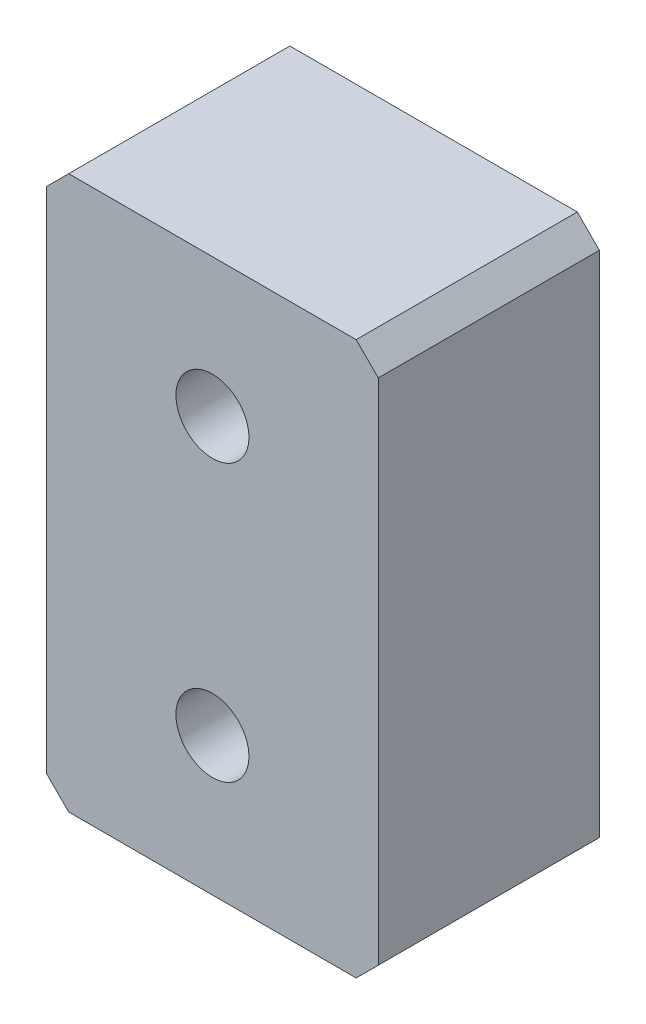
ISO-10303-21;
HEADER;
FILE_DESCRIPTION(('STEP AP214'),'2;1');
FILE_NAME('part.step','',(''),(''),'','','');
FILE_SCHEMA(('AUTOMOTIVE_DESIGN { 1 0 10303 214 1 1 1 1 }'));
ENDSEC;
DATA;
#1=APPLICATION_CONTEXT('core data for automotive mechanical design processes');
#2=APPLICATION_PROTOCOL_DEFINITION('international standard','automotive_design',2000,#1);
#3=PRODUCT_CONTEXT('',#1,'mechanical');
#4=PRODUCT('Part','Part','',(#3));
#5=PRODUCT_RELATED_PRODUCT_CATEGORY('part','',(#4));
#6=PRODUCT_DEFINITION_FORMATION('','',#4);
#7=PRODUCT_DEFINITION_CONTEXT('part definition',#1,'design');
#8=PRODUCT_DEFINITION('design','',#6,#7);
#9=PRODUCT_DEFINITION_SHAPE('','',#8);
#10=(LENGTH_UNIT() NAMED_UNIT(*) SI_UNIT(.MILLI.,.METRE.));
#11=(NAMED_UNIT(*) PLANE_ANGLE_UNIT() SI_UNIT($,.RADIAN.));
#12=(NAMED_UNIT(*) SI_UNIT($,.STERADIAN.) SOLID_ANGLE_UNIT());
#13=UNCERTAINTY_MEASURE_WITH_UNIT(LENGTH_MEASURE(1.E-05),#10,'distance_accuracy_value','');
#14=(GEOMETRIC_REPRESENTATION_CONTEXT(3) GLOBAL_UNCERTAINTY_ASSIGNED_CONTEXT((#13)) GLOBAL_UNIT_ASSIGNED_CONTEXT((#10,
#11,#12)) REPRESENTATION_CONTEXT('',''));
#15=CARTESIAN_POINT('',(0.,0.,0.));
#16=DIRECTION('',(0.,0.,1.));
#17=DIRECTION('',(1.,0.,0.));
#18=AXIS2_PLACEMENT_3D('',#15,#16,#17);
#19=CARTESIAN_POINT('',(6.5,12.5,10.));
#20=DIRECTION('',(-0.707106781186548,-0.707106781186547,0.));
#21=DIRECTION('',(0.707106781186547,-0.707106781186548,0.));
#22=AXIS2_PLACEMENT_3D('',#19,#20,#21);
#23=PLANE('',#22);
#24=DIRECTION('',(0.,0.,1.));
#25=VECTOR('',#24,1.);
#26=CARTESIAN_POINT('',(7.5,11.5,10.));
#27=LINE('',#26,#25);
#28=CARTESIAN_POINT('',(7.5,11.5,10.));
#29=VERTEX_POINT('',#28);
#30=CARTESIAN_POINT('',(7.5,11.5,0.));
#31=VERTEX_POINT('',#30);
#32=EDGE_CURVE('E127',#29,#31,#27,.F.);
#33=ORIENTED_EDGE('',*,*,#32,.T.);
#34=DIRECTION('',(0.707106781186547,-0.707106781186548,0.));
#35=VECTOR('',#34,1.);
#36=CARTESIAN_POINT('',(6.5,12.5,0.));
#37=LINE('',#36,#35);
#38=CARTESIAN_POINT('',(6.5,12.5,0.));
#39=VERTEX_POINT('',#38);
#40=EDGE_CURVE('E165',#39,#31,#37,.T.);
#41=ORIENTED_EDGE('',*,*,#40,.F.);
#42=DIRECTION('',(0.,0.,1.));
#43=VECTOR('',#42,1.);
#44=CARTESIAN_POINT('',(6.5,12.5,10.));
#45=LINE('',#44,#43);
#46=CARTESIAN_POINT('',(6.5,12.5,10.));
#47=VERTEX_POINT('',#46);
#48=EDGE_CURVE('E142',#39,#47,#45,.T.);
#49=ORIENTED_EDGE('',*,*,#48,.T.);
#50=DIRECTION('',(-0.707106781186547,0.707106781186548,0.));
#51=VECTOR('',#50,1.);
#52=CARTESIAN_POINT('',(7.5,11.5,10.));
#53=LINE('',#52,#51);
#54=EDGE_CURVE('E140',#29,#47,#53,.T.);
#55=ORIENTED_EDGE('',*,*,#54,.F.);
#56=EDGE_LOOP('',(#33,#41,#49,#55));
#57=FACE_BOUND('',#56,.T.);
#58=ADVANCED_FACE('F44',(#57),#23,.F.);
#59=CARTESIAN_POINT('',(-7.5,11.5,10.));
#60=DIRECTION('',(0.707106781186546,-0.707106781186549,0.));
#61=DIRECTION('',(0.707106781186549,0.707106781186546,0.));
#62=AXIS2_PLACEMENT_3D('',#59,#60,#61);
#63=PLANE('',#62);
#64=DIRECTION('',(0.,0.,1.));
#65=VECTOR('',#64,1.);
#66=CARTESIAN_POINT('',(-6.49999999999999,12.5,10.));
#67=LINE('',#66,#65);
#68=CARTESIAN_POINT('',(-6.49999999999999,12.5,10.));
#69=VERTEX_POINT('',#68);
#70=CARTESIAN_POINT('',(-6.49999999999999,12.5,0.));
#71=VERTEX_POINT('',#70);
#72=EDGE_CURVE('E149',#69,#71,#67,.F.);
#73=ORIENTED_EDGE('',*,*,#72,.T.);
#74=DIRECTION('',(0.707106781186549,0.707106781186546,0.));
#75=VECTOR('',#74,1.);
#76=CARTESIAN_POINT('',(-7.5,11.5,0.));
#77=LINE('',#76,#75);
#78=CARTESIAN_POINT('',(-7.5,11.5,0.));
#79=VERTEX_POINT('',#78);
#80=EDGE_CURVE('E163',#79,#71,#77,.T.);
#81=ORIENTED_EDGE('',*,*,#80,.F.);
#82=DIRECTION('',(0.,0.,-1.));
#83=VECTOR('',#82,1.);
#84=CARTESIAN_POINT('',(-7.5,11.5,10.));
#85=LINE('',#84,#83);
#86=CARTESIAN_POINT('',(-7.5,11.5,10.));
#87=VERTEX_POINT('',#86);
#88=EDGE_CURVE('E247',#79,#87,#85,.F.);
#89=ORIENTED_EDGE('',*,*,#88,.T.);
#90=DIRECTION('',(-0.707106781186549,-0.707106781186546,0.));
#91=VECTOR('',#90,1.);
#92=CARTESIAN_POINT('',(-6.49999999999999,12.5,10.));
#93=LINE('',#92,#91);
#94=EDGE_CURVE('E145',#69,#87,#93,.T.);
#95=ORIENTED_EDGE('',*,*,#94,.F.);
#96=EDGE_LOOP('',(#73,#81,#89,#95));
#97=FACE_BOUND('',#96,.T.);
#98=ADVANCED_FACE('F218',(#97),#63,.F.);
#99=CARTESIAN_POINT('',(7.5,-11.5,10.));
#100=DIRECTION('',(-0.707106781186548,0.707106781186548,0.));
#101=DIRECTION('',(-0.707106781186548,-0.707106781186548,0.));
#102=AXIS2_PLACEMENT_3D('',#99,#100,#101);
#103=PLANE('',#102);
#104=DIRECTION('',(0.,0.,1.));
#105=VECTOR('',#104,1.);
#106=CARTESIAN_POINT('',(6.49999999999999,-12.5,10.));
#107=LINE('',#106,#105);
#108=CARTESIAN_POINT('',(6.49999999999999,-12.5,10.));
#109=VERTEX_POINT('',#108);
#110=CARTESIAN_POINT('',(6.49999999999999,-12.5,0.));
#111=VERTEX_POINT('',#110);
#112=EDGE_CURVE('E239',#109,#111,#107,.F.);
#113=ORIENTED_EDGE('',*,*,#112,.T.);
#114=DIRECTION('',(-0.707106781186548,-0.707106781186548,0.));
#115=VECTOR('',#114,1.);
#116=CARTESIAN_POINT('',(7.5,-11.5,0.));
#117=LINE('',#116,#115);
#118=CARTESIAN_POINT('',(7.5,-11.5,0.));
#119=VERTEX_POINT('',#118);
#120=EDGE_CURVE('E161',#119,#111,#117,.T.);
#121=ORIENTED_EDGE('',*,*,#120,.F.);
#122=DIRECTION('',(0.,0.,1.));
#123=VECTOR('',#122,1.);
#124=CARTESIAN_POINT('',(7.5,-11.5,10.));
#125=LINE('',#124,#123);
#126=CARTESIAN_POINT('',(7.5,-11.5,10.));
#127=VERTEX_POINT('',#126);
#128=EDGE_CURVE('E136',#119,#127,#125,.T.);
#129=ORIENTED_EDGE('',*,*,#128,.T.);
#130=DIRECTION('',(0.707106781186548,0.707106781186547,0.));
#131=VECTOR('',#130,1.);
#132=CARTESIAN_POINT('',(6.49999999999999,-12.5,10.));
#133=LINE('',#132,#131);
#134=EDGE_CURVE('E119',#109,#127,#133,.T.);
#135=ORIENTED_EDGE('',*,*,#134,.F.);
#136=EDGE_LOOP('',(#113,#121,#129,#135));
#137=FACE_BOUND('',#136,.T.);
#138=ADVANCED_FACE('F216',(#137),#103,.F.);
#139=CARTESIAN_POINT('',(-6.49999999999999,-12.5,10.));
#140=DIRECTION('',(0.707106781186548,0.707106781186548,0.));
#141=DIRECTION('',(-0.707106781186548,0.707106781186548,0.));
#142=AXIS2_PLACEMENT_3D('',#139,#140,#141);
#143=PLANE('',#142);
#144=DIRECTION('',(0.,0.,-1.));
#145=VECTOR('',#144,1.);
#146=CARTESIAN_POINT('',(-7.5,-11.5,10.));
#147=LINE('',#146,#145);
#148=CARTESIAN_POINT('',(-7.5,-11.5,10.));
#149=VERTEX_POINT('',#148);
#150=CARTESIAN_POINT('',(-7.5,-11.5,0.));
#151=VERTEX_POINT('',#150);
#152=EDGE_CURVE('E242',#149,#151,#147,.T.);
#153=ORIENTED_EDGE('',*,*,#152,.T.);
#154=DIRECTION('',(-0.707106781186548,0.707106781186548,0.));
#155=VECTOR('',#154,1.);
#156=CARTESIAN_POINT('',(-6.49999999999999,-12.5,0.));
#157=LINE('',#156,#155);
#158=CARTESIAN_POINT('',(-6.49999999999999,-12.5,0.));
#159=VERTEX_POINT('',#158);
#160=EDGE_CURVE('E62',#159,#151,#157,.T.);
#161=ORIENTED_EDGE('',*,*,#160,.F.);
#162=DIRECTION('',(0.,0.,1.));
#163=VECTOR('',#162,1.);
#164=CARTESIAN_POINT('',(-6.49999999999999,-12.5,10.));
#165=LINE('',#164,#163);
#166=CARTESIAN_POINT('',(-6.49999999999999,-12.5,10.));
#167=VERTEX_POINT('',#166);
#168=EDGE_CURVE('E237',#159,#167,#165,.T.);
#169=ORIENTED_EDGE('',*,*,#168,.T.);
#170=DIRECTION('',(0.707106781186548,-0.707106781186548,0.));
#171=VECTOR('',#170,1.);
#172=CARTESIAN_POINT('',(-7.5,-11.5,10.));
#173=LINE('',#172,#171);
#174=EDGE_CURVE('E158',#149,#167,#173,.T.);
#175=ORIENTED_EDGE('',*,*,#174,.F.);
#176=EDGE_LOOP('',(#153,#161,#169,#175));
#177=FACE_BOUND('',#176,.T.);
#178=ADVANCED_FACE('F213',(#177),#143,.F.);
#179=CARTESIAN_POINT('',(0.,0.,10.));
#180=DIRECTION('',(0.,0.,1.));
#181=DIRECTION('',(1.,0.,0.));
#182=AXIS2_PLACEMENT_3D('',#179,#180,#181);
#183=PLANE('',#182);
#184=DIRECTION('',(1.,0.,0.));
#185=VECTOR('',#184,1.);
#186=CARTESIAN_POINT('',(7.5,12.5,10.));
#187=LINE('',#186,#185);
#188=EDGE_CURVE('E249',#47,#69,#187,.F.);
#189=ORIENTED_EDGE('',*,*,#188,.T.);
#190=ORIENTED_EDGE('',*,*,#94,.T.);
#191=DIRECTION('',(0.,1.,0.));
#192=VECTOR('',#191,1.);
#193=CARTESIAN_POINT('',(-7.5,-12.5,10.));
#194=LINE('',#193,#192);
#195=EDGE_CURVE('E244',#87,#149,#194,.F.);
#196=ORIENTED_EDGE('',*,*,#195,.T.);
#197=ORIENTED_EDGE('',*,*,#174,.T.);
#198=DIRECTION('',(-1.,0.,0.));
#199=VECTOR('',#198,1.);
#200=CARTESIAN_POINT('',(7.5,-12.5,10.));
#201=LINE('',#200,#199);
#202=EDGE_CURVE('E172',#167,#109,#201,.F.);
#203=ORIENTED_EDGE('',*,*,#202,.T.);
#204=ORIENTED_EDGE('',*,*,#134,.T.);
#205=DIRECTION('',(0.,1.,0.));
#206=VECTOR('',#205,1.);
#207=CARTESIAN_POINT('',(7.5,-12.5,10.));
#208=LINE('',#207,#206);
#209=EDGE_CURVE('E131',#127,#29,#208,.T.);
#210=ORIENTED_EDGE('',*,*,#209,.T.);
#211=ORIENTED_EDGE('',*,*,#54,.T.);
#212=EDGE_LOOP('',(#189,#190,#196,#197,#203,#204,#210,#211));
#213=FACE_BOUND('',#212,.T.);
#214=CARTESIAN_POINT('',(6.65210025759947E-13,6.24999999999959,10.));
#215=DIRECTION('',(0.,0.,-1.));
#216=DIRECTION('',(-1.,0.,0.));
#217=AXIS2_PLACEMENT_3D('',#214,#215,#216);
#218=CIRCLE('',#217,1.65);
#219=CARTESIAN_POINT('',(-1.64999999999933,6.24999999999959,10.));
#220=VERTEX_POINT('',#219);
#221=EDGE_CURVE('E137',#220,#220,#218,.T.);
#222=ORIENTED_EDGE('',*,*,#221,.T.);
#223=EDGE_LOOP('',(#222));
#224=FACE_BOUND('',#223,.T.);
#225=CARTESIAN_POINT('',(6.65873381729246E-13,-6.25000000000041,10.));
#226=DIRECTION('',(0.,0.,-1.));
#227=DIRECTION('',(-1.,0.,0.));
#228=AXIS2_PLACEMENT_3D('',#225,#226,#227);
#229=CIRCLE('',#228,1.65);
#230=CARTESIAN_POINT('',(-1.64999999999933,-6.25000000000041,10.));
#231=VERTEX_POINT('',#230);
#232=EDGE_CURVE('E47',#231,#231,#229,.T.);
#233=ORIENTED_EDGE('',*,*,#232,.T.);
#234=EDGE_LOOP('',(#233));
#235=FACE_BOUND('',#234,.T.);
#236=ADVANCED_FACE('F147',(#213,#224,#235),#183,.T.);
#237=CARTESIAN_POINT('',(6.65873381729246E-13,-6.25000000000041,0.));
#238=DIRECTION('',(0.,0.,-1.));
#239=DIRECTION('',(-1.,0.,0.));
#240=AXIS2_PLACEMENT_3D('',#237,#238,#239);
#241=CYLINDRICAL_SURFACE('',#240,1.65);
#242=ORIENTED_EDGE('',*,*,#232,.F.);
#243=EDGE_LOOP('',(#242));
#244=FACE_BOUND('',#243,.T.);
#245=CARTESIAN_POINT('',(6.65873381729246E-13,-6.25000000000041,0.));
#246=DIRECTION('',(0.,0.,-1.));
#247=DIRECTION('',(-1.,0.,0.));
#248=AXIS2_PLACEMENT_3D('',#245,#246,#247);
#249=CIRCLE('',#248,1.65);
#250=CARTESIAN_POINT('',(-1.64999999999933,-6.25000000000041,0.));
#251=VERTEX_POINT('',#250);
#252=EDGE_CURVE('E170',#251,#251,#249,.T.);
#253=ORIENTED_EDGE('',*,*,#252,.T.);
#254=EDGE_LOOP('',(#253));
#255=FACE_BOUND('',#254,.T.);
#256=ADVANCED_FACE('F179',(#244,#255),#241,.F.);
#257=CARTESIAN_POINT('',(6.65210025759947E-13,6.24999999999959,0.));
#258=DIRECTION('',(0.,0.,-1.));
#259=DIRECTION('',(-1.,0.,0.));
#260=AXIS2_PLACEMENT_3D('',#257,#258,#259);
#261=CYLINDRICAL_SURFACE('',#260,1.65);
#262=ORIENTED_EDGE('',*,*,#221,.F.);
#263=EDGE_LOOP('',(#262));
#264=FACE_BOUND('',#263,.T.);
#265=CARTESIAN_POINT('',(6.65210025759947E-13,6.24999999999959,0.));
#266=DIRECTION('',(0.,0.,-1.));
#267=DIRECTION('',(-1.,0.,0.));
#268=AXIS2_PLACEMENT_3D('',#265,#266,#267);
#269=CIRCLE('',#268,1.65);
#270=CARTESIAN_POINT('',(-1.64999999999933,6.24999999999959,0.));
#271=VERTEX_POINT('',#270);
#272=EDGE_CURVE('E167',#271,#271,#269,.T.);
#273=ORIENTED_EDGE('',*,*,#272,.T.);
#274=EDGE_LOOP('',(#273));
#275=FACE_BOUND('',#274,.T.);
#276=ADVANCED_FACE('F182',(#264,#275),#261,.F.);
#277=CARTESIAN_POINT('',(7.5,-12.5,10.));
#278=DIRECTION('',(-1.,0.,0.));
#279=DIRECTION('',(0.,0.,1.));
#280=AXIS2_PLACEMENT_3D('',#277,#278,#279);
#281=PLANE('',#280);
#282=ORIENTED_EDGE('',*,*,#128,.F.);
#283=DIRECTION('',(0.,1.,0.));
#284=VECTOR('',#283,1.);
#285=CARTESIAN_POINT('',(7.5,0.,0.));
#286=LINE('',#285,#284);
#287=EDGE_CURVE('E134',#119,#31,#286,.T.);
#288=ORIENTED_EDGE('',*,*,#287,.T.);
#289=ORIENTED_EDGE('',*,*,#32,.F.);
#290=ORIENTED_EDGE('',*,*,#209,.F.);
#291=EDGE_LOOP('',(#282,#288,#289,#290));
#292=FACE_BOUND('',#291,.T.);
#293=ADVANCED_FACE('F130',(#292),#281,.F.);
#294=CARTESIAN_POINT('',(7.5,12.5,10.));
#295=DIRECTION('',(0.,-1.,0.));
#296=DIRECTION('',(1.,0.,0.));
#297=AXIS2_PLACEMENT_3D('',#294,#295,#296);
#298=PLANE('',#297);
#299=ORIENTED_EDGE('',*,*,#48,.F.);
#300=DIRECTION('',(1.,0.,0.));
#301=VECTOR('',#300,1.);
#302=CARTESIAN_POINT('',(0.,12.5,0.));
#303=LINE('',#302,#301);
#304=EDGE_CURVE('E230',#39,#71,#303,.F.);
#305=ORIENTED_EDGE('',*,*,#304,.T.);
#306=ORIENTED_EDGE('',*,*,#72,.F.);
#307=ORIENTED_EDGE('',*,*,#188,.F.);
#308=EDGE_LOOP('',(#299,#305,#306,#307));
#309=FACE_BOUND('',#308,.T.);
#310=ADVANCED_FACE('F201',(#309),#298,.F.);
#311=CARTESIAN_POINT('',(-7.5,-12.5,10.));
#312=DIRECTION('',(1.,0.,0.));
#313=DIRECTION('',(0.,0.,-1.));
#314=AXIS2_PLACEMENT_3D('',#311,#312,#313);
#315=PLANE('',#314);
#316=ORIENTED_EDGE('',*,*,#152,.F.);
#317=ORIENTED_EDGE('',*,*,#195,.F.);
#318=ORIENTED_EDGE('',*,*,#88,.F.);
#319=DIRECTION('',(0.,1.,0.));
#320=VECTOR('',#319,1.);
#321=CARTESIAN_POINT('',(-7.5,0.,0.));
#322=LINE('',#321,#320);
#323=EDGE_CURVE('E53',#79,#151,#322,.F.);
#324=ORIENTED_EDGE('',*,*,#323,.T.);
#325=EDGE_LOOP('',(#316,#317,#318,#324));
#326=FACE_BOUND('',#325,.T.);
#327=ADVANCED_FACE('F194',(#326),#315,.F.);
#328=CARTESIAN_POINT('',(7.5,-12.5,10.));
#329=DIRECTION('',(0.,1.,0.));
#330=DIRECTION('',(-1.,0.,0.));
#331=AXIS2_PLACEMENT_3D('',#328,#329,#330);
#332=PLANE('',#331);
#333=ORIENTED_EDGE('',*,*,#168,.F.);
#334=DIRECTION('',(1.,0.,0.));
#335=VECTOR('',#334,1.);
#336=CARTESIAN_POINT('',(0.,-12.5,0.));
#337=LINE('',#336,#335);
#338=EDGE_CURVE('E11',#159,#111,#337,.T.);
#339=ORIENTED_EDGE('',*,*,#338,.T.);
#340=ORIENTED_EDGE('',*,*,#112,.F.);
#341=ORIENTED_EDGE('',*,*,#202,.F.);
#342=EDGE_LOOP('',(#333,#339,#340,#341));
#343=FACE_BOUND('',#342,.T.);
#344=ADVANCED_FACE('F188',(#343),#332,.F.);
#345=CARTESIAN_POINT('',(0.,0.,0.));
#346=DIRECTION('',(0.,0.,1.));
#347=DIRECTION('',(1.,0.,0.));
#348=AXIS2_PLACEMENT_3D('',#345,#346,#347);
#349=PLANE('',#348);
#350=ORIENTED_EDGE('',*,*,#160,.T.);
#351=ORIENTED_EDGE('',*,*,#323,.F.);
#352=ORIENTED_EDGE('',*,*,#80,.T.);
#353=ORIENTED_EDGE('',*,*,#304,.F.);
#354=ORIENTED_EDGE('',*,*,#40,.T.);
#355=ORIENTED_EDGE('',*,*,#287,.F.);
#356=ORIENTED_EDGE('',*,*,#120,.T.);
#357=ORIENTED_EDGE('',*,*,#338,.F.);
#358=EDGE_LOOP('',(#350,#351,#352,#353,#354,#355,#356,#357));
#359=FACE_BOUND('',#358,.T.);
#360=ORIENTED_EDGE('',*,*,#272,.F.);
#361=EDGE_LOOP('',(#360));
#362=FACE_BOUND('',#361,.T.);
#363=ORIENTED_EDGE('',*,*,#252,.F.);
#364=EDGE_LOOP('',(#363));
#365=FACE_BOUND('',#364,.T.);
#366=ADVANCED_FACE('F186',(#359,#362,#365),#349,.F.);
#367=CLOSED_SHELL('',(#58,#98,#138,#178,#236,#256,#276,#293,#310,#327,#344,#366));
#368=MANIFOLD_SOLID_BREP('B2',#367);
#369=ADVANCED_BREP_SHAPE_REPRESENTATION('',(#18,#368),#14);
#370=SHAPE_DEFINITION_REPRESENTATION(#9,#369);
ENDSEC;
END-ISO-10303-21;
